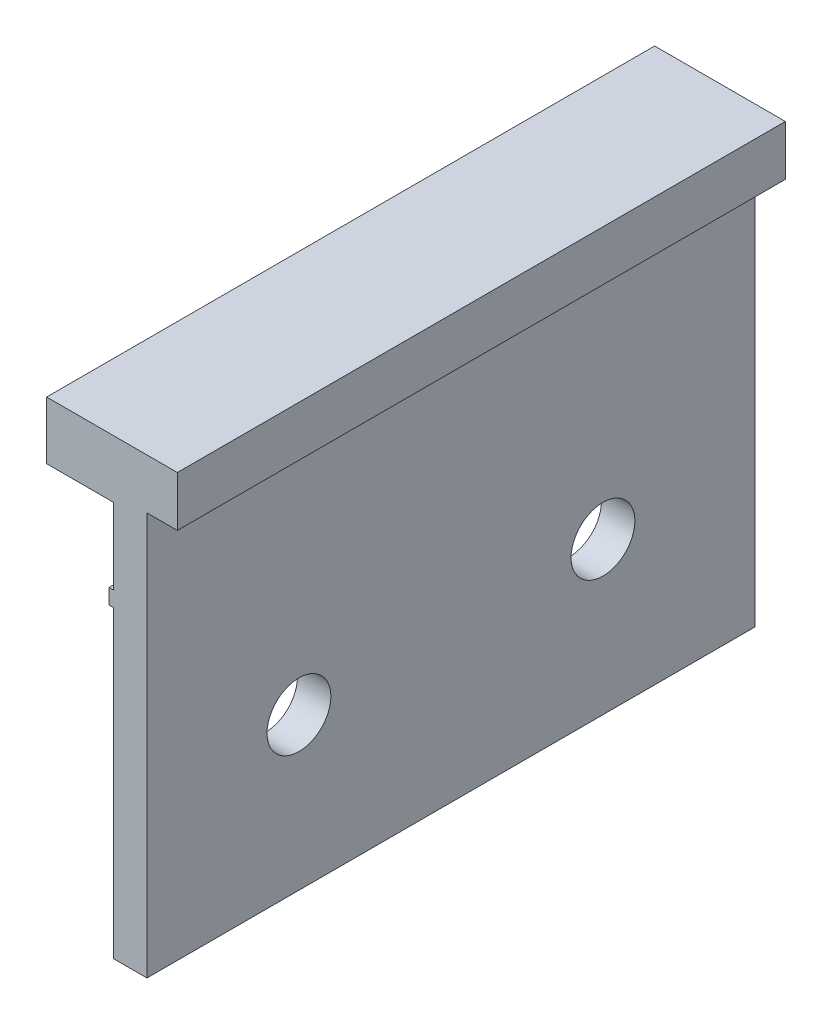
ISO-10303-21;
HEADER;
FILE_DESCRIPTION(('STEP AP214'),'2;1');
FILE_NAME('part.step','',(''),(''),'','','');
FILE_SCHEMA(('AUTOMOTIVE_DESIGN { 1 0 10303 214 1 1 1 1 }'));
ENDSEC;
DATA;
#1=APPLICATION_CONTEXT('core data for automotive mechanical design processes');
#2=APPLICATION_PROTOCOL_DEFINITION('international standard','automotive_design',2000,#1);
#3=PRODUCT_CONTEXT('',#1,'mechanical');
#4=PRODUCT('Part','Part','',(#3));
#5=PRODUCT_RELATED_PRODUCT_CATEGORY('part','',(#4));
#6=PRODUCT_DEFINITION_FORMATION('','',#4);
#7=PRODUCT_DEFINITION_CONTEXT('part definition',#1,'design');
#8=PRODUCT_DEFINITION('design','',#6,#7);
#9=PRODUCT_DEFINITION_SHAPE('','',#8);
#10=(LENGTH_UNIT() NAMED_UNIT(*) SI_UNIT(.MILLI.,.METRE.));
#11=(NAMED_UNIT(*) PLANE_ANGLE_UNIT() SI_UNIT($,.RADIAN.));
#12=(NAMED_UNIT(*) SI_UNIT($,.STERADIAN.) SOLID_ANGLE_UNIT());
#13=UNCERTAINTY_MEASURE_WITH_UNIT(LENGTH_MEASURE(1.E-05),#10,'distance_accuracy_value','');
#14=(GEOMETRIC_REPRESENTATION_CONTEXT(3) GLOBAL_UNCERTAINTY_ASSIGNED_CONTEXT((#13)) GLOBAL_UNIT_ASSIGNED_CONTEXT((#10,
#11,#12)) REPRESENTATION_CONTEXT('',''));
#15=CARTESIAN_POINT('',(0.,0.,0.));
#16=DIRECTION('',(0.,0.,1.));
#17=DIRECTION('',(1.,0.,0.));
#18=AXIS2_PLACEMENT_3D('',#15,#16,#17);
#19=CARTESIAN_POINT('',(-5.00000036964821,-291545.,51.0161248385694));
#20=DIRECTION('',(1.,0.,0.));
#21=DIRECTION('',(0.,0.,-1.));
#22=AXIS2_PLACEMENT_3D('',#19,#20,#21);
#23=PLANE('',#22);
#24=CARTESIAN_POINT('',(-5.00000036964821,-39.9999996303306,10.));
#25=DIRECTION('',(1.,0.,0.));
#26=DIRECTION('',(0.,0.,-1.));
#27=AXIS2_PLACEMENT_3D('',#24,#25,#26);
#28=CIRCLE('',#27,2.1);
#29=CARTESIAN_POINT('',(-5.00000036964821,-39.9999996303306,7.9));
#30=VERTEX_POINT('',#29);
#31=EDGE_CURVE('E193',#30,#30,#28,.T.);
#32=ORIENTED_EDGE('',*,*,#31,.T.);
#33=EDGE_LOOP('',(#32));
#34=FACE_BOUND('',#33,.T.);
#35=CARTESIAN_POINT('',(-5.00000036964821,-39.9999996303306,-10.));
#36=DIRECTION('',(1.,0.,0.));
#37=DIRECTION('',(0.,0.,-1.));
#38=AXIS2_PLACEMENT_3D('',#35,#36,#37);
#39=CIRCLE('',#38,2.1);
#40=CARTESIAN_POINT('',(-5.00000036964821,-39.9999996303306,-12.1));
#41=VERTEX_POINT('',#40);
#42=EDGE_CURVE('E192',#41,#41,#39,.T.);
#43=ORIENTED_EDGE('',*,*,#42,.T.);
#44=EDGE_LOOP('',(#43));
#45=FACE_BOUND('',#44,.T.);
#46=DIRECTION('',(0.,0.,-1.));
#47=VECTOR('',#46,1.);
#48=CARTESIAN_POINT('',(-5.00000036964821,-29.99999963032,21.0440306508794));
#49=LINE('',#48,#47);
#50=CARTESIAN_POINT('',(-5.00000036964821,-29.99999963032,20.));
#51=VERTEX_POINT('',#50);
#52=CARTESIAN_POINT('',(-5.00000036964821,-29.99999963032,-20.));
#53=VERTEX_POINT('',#52);
#54=EDGE_CURVE('E145',#51,#53,#49,.T.);
#55=ORIENTED_EDGE('',*,*,#54,.T.);
#56=DIRECTION('',(0.,-1.,0.));
#57=VECTOR('',#56,1.);
#58=CARTESIAN_POINT('',(-5.00000036964821,-291545.,-20.));
#59=LINE('',#58,#57);
#60=CARTESIAN_POINT('',(-5.00000036964821,-49.9999996303586,-20.));
#61=VERTEX_POINT('',#60);
#62=EDGE_CURVE('E180',#53,#61,#59,.T.);
#63=ORIENTED_EDGE('',*,*,#62,.T.);
#64=DIRECTION('',(0.,0.,-1.));
#65=VECTOR('',#64,1.);
#66=CARTESIAN_POINT('',(-5.00000036964821,-49.9999996303586,51.0161248385694));
#67=LINE('',#66,#65);
#68=CARTESIAN_POINT('',(-5.00000036964821,-49.9999996303586,20.));
#69=VERTEX_POINT('',#68);
#70=EDGE_CURVE('E181',#69,#61,#67,.T.);
#71=ORIENTED_EDGE('',*,*,#70,.F.);
#72=DIRECTION('',(0.,-1.,0.));
#73=VECTOR('',#72,1.);
#74=CARTESIAN_POINT('',(-5.00000036964821,-291545.,20.));
#75=LINE('',#74,#73);
#76=EDGE_CURVE('E151',#51,#69,#75,.T.);
#77=ORIENTED_EDGE('',*,*,#76,.F.);
#78=EDGE_LOOP('',(#55,#63,#71,#77));
#79=FACE_BOUND('',#78,.T.);
#80=ADVANCED_FACE('F35',(#34,#45,#79),#23,.F.);
#81=DIRECTION('',(0.,0.,-1.));
#82=VECTOR('',#81,1.);
#83=CARTESIAN_POINT('',(-5.00000036964821,-28.9999996303436,21.0440306508794));
#84=LINE('',#83,#82);
#85=CARTESIAN_POINT('',(-5.00000036964821,-28.9999996303436,20.));
#86=VERTEX_POINT('',#85);
#87=CARTESIAN_POINT('',(-5.00000036964821,-28.9999996303436,-20.));
#88=VERTEX_POINT('',#87);
#89=EDGE_CURVE('E130',#86,#88,#84,.T.);
#90=ORIENTED_EDGE('',*,*,#89,.F.);
#91=CARTESIAN_POINT('',(-5.00000036964821,-23.9999996303482,20.));
#92=VERTEX_POINT('',#91);
#93=EDGE_CURVE('E141',#92,#86,#75,.T.);
#94=ORIENTED_EDGE('',*,*,#93,.F.);
#95=DIRECTION('',(0.,0.,-1.));
#96=VECTOR('',#95,1.);
#97=CARTESIAN_POINT('',(-5.00000036964821,-23.9999996303482,51.0161248385694));
#98=LINE('',#97,#96);
#99=CARTESIAN_POINT('',(-5.00000036964821,-23.9999996303482,-20.));
#100=VERTEX_POINT('',#99);
#101=EDGE_CURVE('E178',#92,#100,#98,.T.);
#102=ORIENTED_EDGE('',*,*,#101,.T.);
#103=EDGE_CURVE('E144',#100,#88,#59,.T.);
#104=ORIENTED_EDGE('',*,*,#103,.T.);
#105=EDGE_LOOP('',(#90,#94,#102,#104));
#106=FACE_BOUND('',#105,.T.);
#107=ADVANCED_FACE('F140',(#106),#23,.F.);
#108=CARTESIAN_POINT('',(-0.80000036967931,-291545.,51.0161248385694));
#109=DIRECTION('',(-1.,0.,0.));
#110=DIRECTION('',(0.,0.,1.));
#111=AXIS2_PLACEMENT_3D('',#108,#109,#110);
#112=PLANE('',#111);
#113=DIRECTION('',(0.,1.,0.));
#114=VECTOR('',#113,1.);
#115=CARTESIAN_POINT('',(-0.80000036967931,-291545.,20.));
#116=LINE('',#115,#114);
#117=CARTESIAN_POINT('',(-0.80000036967931,-23.4999996303031,20.));
#118=VERTEX_POINT('',#117);
#119=CARTESIAN_POINT('',(-0.80000036967931,-20.1999996303357,20.));
#120=VERTEX_POINT('',#119);
#121=EDGE_CURVE('E162',#118,#120,#116,.T.);
#122=ORIENTED_EDGE('',*,*,#121,.F.);
#123=DIRECTION('',(0.,0.,-1.));
#124=VECTOR('',#123,1.);
#125=CARTESIAN_POINT('',(-0.80000036967931,-23.4999996303031,51.0161248385694));
#126=LINE('',#125,#124);
#127=CARTESIAN_POINT('',(-0.80000036967931,-23.4999996303031,-20.));
#128=VERTEX_POINT('',#127);
#129=EDGE_CURVE('E60',#118,#128,#126,.T.);
#130=ORIENTED_EDGE('',*,*,#129,.T.);
#131=DIRECTION('',(0.,1.,0.));
#132=VECTOR('',#131,1.);
#133=CARTESIAN_POINT('',(-0.80000036967931,-291545.,-20.));
#134=LINE('',#133,#132);
#135=CARTESIAN_POINT('',(-0.80000036967931,-20.1999996303357,-20.));
#136=VERTEX_POINT('',#135);
#137=EDGE_CURVE('E171',#128,#136,#134,.T.);
#138=ORIENTED_EDGE('',*,*,#137,.T.);
#139=DIRECTION('',(0.,0.,-1.));
#140=VECTOR('',#139,1.);
#141=CARTESIAN_POINT('',(-0.80000036967931,-20.1999996303357,51.0161248385694));
#142=LINE('',#141,#140);
#143=EDGE_CURVE('E168',#120,#136,#142,.T.);
#144=ORIENTED_EDGE('',*,*,#143,.F.);
#145=EDGE_LOOP('',(#122,#130,#138,#144));
#146=FACE_BOUND('',#145,.T.);
#147=ADVANCED_FACE('F233',(#146),#112,.F.);
#148=CARTESIAN_POINT('',(-400000.,-20.1999996303357,51.0161248385694));
#149=DIRECTION('',(0.,-1.,0.));
#150=DIRECTION('',(0.,0.,-1.));
#151=AXIS2_PLACEMENT_3D('',#148,#149,#150);
#152=PLANE('',#151);
#153=DIRECTION('',(-1.,0.,0.));
#154=VECTOR('',#153,1.);
#155=CARTESIAN_POINT('',(-400000.,-20.1999996303357,20.));
#156=LINE('',#155,#154);
#157=CARTESIAN_POINT('',(-9.40000036969998,-20.1999996303357,20.));
#158=VERTEX_POINT('',#157);
#159=EDGE_CURVE('E159',#120,#158,#156,.T.);
#160=ORIENTED_EDGE('',*,*,#159,.F.);
#161=ORIENTED_EDGE('',*,*,#143,.T.);
#162=DIRECTION('',(-1.,0.,0.));
#163=VECTOR('',#162,1.);
#164=CARTESIAN_POINT('',(-400000.,-20.1999996303357,-20.));
#165=LINE('',#164,#163);
#166=CARTESIAN_POINT('',(-9.40000036969998,-20.1999996303357,-20.));
#167=VERTEX_POINT('',#166);
#168=EDGE_CURVE('E170',#136,#167,#165,.T.);
#169=ORIENTED_EDGE('',*,*,#168,.T.);
#170=DIRECTION('',(0.,0.,-1.));
#171=VECTOR('',#170,1.);
#172=CARTESIAN_POINT('',(-9.40000036969998,-20.1999996303357,51.0161248385694));
#173=LINE('',#172,#171);
#174=EDGE_CURVE('E172',#158,#167,#173,.T.);
#175=ORIENTED_EDGE('',*,*,#174,.F.);
#176=EDGE_LOOP('',(#160,#161,#169,#175));
#177=FACE_BOUND('',#176,.T.);
#178=ADVANCED_FACE('F243',(#177),#152,.F.);
#179=CARTESIAN_POINT('',(-9.4000003695669,-291545.,51.0161248385694));
#180=DIRECTION('',(1.,0.,0.));
#181=DIRECTION('',(0.,1.,0.));
#182=AXIS2_PLACEMENT_3D('',#179,#180,#181);
#183=PLANE('',#182);
#184=DIRECTION('',(0.,-1.,0.));
#185=VECTOR('',#184,1.);
#186=CARTESIAN_POINT('',(-9.4000003695669,-291545.,20.));
#187=LINE('',#186,#185);
#188=CARTESIAN_POINT('',(-9.40000036968058,-23.9999996303537,20.));
#189=VERTEX_POINT('',#188);
#190=EDGE_CURVE('E157',#158,#189,#187,.T.);
#191=ORIENTED_EDGE('',*,*,#190,.F.);
#192=ORIENTED_EDGE('',*,*,#174,.T.);
#193=DIRECTION('',(0.,-1.,0.));
#194=VECTOR('',#193,1.);
#195=CARTESIAN_POINT('',(-9.4000003695669,-291545.,-20.));
#196=LINE('',#195,#194);
#197=CARTESIAN_POINT('',(-9.40000036968058,-23.9999996303537,-20.));
#198=VERTEX_POINT('',#197);
#199=EDGE_CURVE('E174',#167,#198,#196,.T.);
#200=ORIENTED_EDGE('',*,*,#199,.T.);
#201=DIRECTION('',(0.,0.,-1.));
#202=VECTOR('',#201,1.);
#203=CARTESIAN_POINT('',(-9.40000036968058,-23.9999996303537,51.0161248385694));
#204=LINE('',#203,#202);
#205=EDGE_CURVE('E175',#189,#198,#204,.T.);
#206=ORIENTED_EDGE('',*,*,#205,.F.);
#207=EDGE_LOOP('',(#191,#192,#200,#206));
#208=FACE_BOUND('',#207,.T.);
#209=ADVANCED_FACE('F267',(#208),#183,.F.);
#210=CARTESIAN_POINT('',(-399999.999999999,-23.9999996297229,51.0161248385694));
#211=DIRECTION('',(0.,1.,0.));
#212=DIRECTION('',(-1.,0.,0.));
#213=AXIS2_PLACEMENT_3D('',#210,#211,#212);
#214=PLANE('',#213);
#215=DIRECTION('',(1.,0.,0.));
#216=VECTOR('',#215,1.);
#217=CARTESIAN_POINT('',(-399999.999999999,-23.9999996297229,20.));
#218=LINE('',#217,#216);
#219=EDGE_CURVE('E150',#189,#92,#218,.T.);
#220=ORIENTED_EDGE('',*,*,#219,.F.);
#221=ORIENTED_EDGE('',*,*,#205,.T.);
#222=DIRECTION('',(1.,0.,0.));
#223=VECTOR('',#222,1.);
#224=CARTESIAN_POINT('',(-399999.999999999,-23.9999996297229,-20.));
#225=LINE('',#224,#223);
#226=EDGE_CURVE('E177',#198,#100,#225,.T.);
#227=ORIENTED_EDGE('',*,*,#226,.T.);
#228=ORIENTED_EDGE('',*,*,#101,.F.);
#229=EDGE_LOOP('',(#220,#221,#227,#228));
#230=FACE_BOUND('',#229,.T.);
#231=ADVANCED_FACE('F264',(#230),#214,.F.);
#232=CARTESIAN_POINT('',(-400000.,-49.9999996303586,51.0161248385694));
#233=DIRECTION('',(0.,1.,0.));
#234=DIRECTION('',(0.,0.,1.));
#235=AXIS2_PLACEMENT_3D('',#232,#233,#234);
#236=PLANE('',#235);
#237=DIRECTION('',(1.,0.,0.));
#238=VECTOR('',#237,1.);
#239=CARTESIAN_POINT('',(-400000.,-49.9999996303586,20.));
#240=LINE('',#239,#238);
#241=CARTESIAN_POINT('',(-2.80000036968886,-49.9999996303586,20.));
#242=VERTEX_POINT('',#241);
#243=EDGE_CURVE('E44',#69,#242,#240,.T.);
#244=ORIENTED_EDGE('',*,*,#243,.F.);
#245=ORIENTED_EDGE('',*,*,#70,.T.);
#246=DIRECTION('',(1.,0.,0.));
#247=VECTOR('',#246,1.);
#248=CARTESIAN_POINT('',(-400000.,-49.9999996303586,-20.));
#249=LINE('',#248,#247);
#250=CARTESIAN_POINT('',(-2.80000036968886,-49.9999996303586,-20.));
#251=VERTEX_POINT('',#250);
#252=EDGE_CURVE('E184',#61,#251,#249,.T.);
#253=ORIENTED_EDGE('',*,*,#252,.T.);
#254=DIRECTION('',(0.,0.,-1.));
#255=VECTOR('',#254,1.);
#256=CARTESIAN_POINT('',(-2.80000036968886,-49.9999996303586,51.0161248385694));
#257=LINE('',#256,#255);
#258=EDGE_CURVE('E185',#242,#251,#257,.T.);
#259=ORIENTED_EDGE('',*,*,#258,.F.);
#260=EDGE_LOOP('',(#244,#245,#253,#259));
#261=FACE_BOUND('',#260,.T.);
#262=ADVANCED_FACE('F253',(#261),#236,.F.);
#263=CARTESIAN_POINT('',(-2.80000036968886,-291545.,51.0161248385694));
#264=DIRECTION('',(-1.,0.,0.));
#265=DIRECTION('',(0.,0.,1.));
#266=AXIS2_PLACEMENT_3D('',#263,#264,#265);
#267=PLANE('',#266);
#268=CARTESIAN_POINT('',(-2.80000036968886,-39.9999996303306,10.));
#269=DIRECTION('',(-1.,0.,0.));
#270=DIRECTION('',(0.,0.,1.));
#271=AXIS2_PLACEMENT_3D('',#268,#269,#270);
#272=CIRCLE('',#271,2.1);
#273=CARTESIAN_POINT('',(-2.80000036968886,-39.9999996303306,12.1));
#274=VERTEX_POINT('',#273);
#275=EDGE_CURVE('E39',#274,#274,#272,.T.);
#276=ORIENTED_EDGE('',*,*,#275,.T.);
#277=EDGE_LOOP('',(#276));
#278=FACE_BOUND('',#277,.T.);
#279=CARTESIAN_POINT('',(-2.80000036968886,-39.9999996303306,-10.));
#280=DIRECTION('',(-1.,0.,0.));
#281=DIRECTION('',(0.,0.,1.));
#282=AXIS2_PLACEMENT_3D('',#279,#280,#281);
#283=CIRCLE('',#282,2.1);
#284=CARTESIAN_POINT('',(-2.80000036968886,-39.9999996303306,-7.9));
#285=VERTEX_POINT('',#284);
#286=EDGE_CURVE('E190',#285,#285,#283,.T.);
#287=ORIENTED_EDGE('',*,*,#286,.T.);
#288=EDGE_LOOP('',(#287));
#289=FACE_BOUND('',#288,.T.);
#290=DIRECTION('',(0.,1.,0.));
#291=VECTOR('',#290,1.);
#292=CARTESIAN_POINT('',(-2.80000036968886,-291545.,20.));
#293=LINE('',#292,#291);
#294=CARTESIAN_POINT('',(-2.80000036968886,-23.4999996303031,20.));
#295=VERTEX_POINT('',#294);
#296=EDGE_CURVE('E11',#242,#295,#293,.T.);
#297=ORIENTED_EDGE('',*,*,#296,.F.);
#298=ORIENTED_EDGE('',*,*,#258,.T.);
#299=DIRECTION('',(0.,1.,0.));
#300=VECTOR('',#299,1.);
#301=CARTESIAN_POINT('',(-2.80000036968886,-291545.,-20.));
#302=LINE('',#301,#300);
#303=CARTESIAN_POINT('',(-2.80000036968886,-23.4999996303031,-20.));
#304=VERTEX_POINT('',#303);
#305=EDGE_CURVE('E187',#251,#304,#302,.T.);
#306=ORIENTED_EDGE('',*,*,#305,.T.);
#307=DIRECTION('',(0.,0.,-1.));
#308=VECTOR('',#307,1.);
#309=CARTESIAN_POINT('',(-2.80000036968886,-23.4999996303031,51.0161248385694));
#310=LINE('',#309,#308);
#311=EDGE_CURVE('E188',#295,#304,#310,.T.);
#312=ORIENTED_EDGE('',*,*,#311,.F.);
#313=EDGE_LOOP('',(#297,#298,#306,#312));
#314=FACE_BOUND('',#313,.T.);
#315=ADVANCED_FACE('F246',(#278,#289,#314),#267,.F.);
#316=CARTESIAN_POINT('',(-400000.,-23.4999996303031,51.0161248385694));
#317=DIRECTION('',(0.,1.,0.));
#318=DIRECTION('',(0.,0.,1.));
#319=AXIS2_PLACEMENT_3D('',#316,#317,#318);
#320=PLANE('',#319);
#321=DIRECTION('',(1.,0.,0.));
#322=VECTOR('',#321,1.);
#323=CARTESIAN_POINT('',(-400000.,-23.4999996303031,20.));
#324=LINE('',#323,#322);
#325=EDGE_CURVE('E165',#295,#118,#324,.T.);
#326=ORIENTED_EDGE('',*,*,#325,.F.);
#327=ORIENTED_EDGE('',*,*,#311,.T.);
#328=DIRECTION('',(1.,0.,0.));
#329=VECTOR('',#328,1.);
#330=CARTESIAN_POINT('',(-400000.,-23.4999996303031,-20.));
#331=LINE('',#330,#329);
#332=EDGE_CURVE('E167',#304,#128,#331,.T.);
#333=ORIENTED_EDGE('',*,*,#332,.T.);
#334=ORIENTED_EDGE('',*,*,#129,.F.);
#335=EDGE_LOOP('',(#326,#327,#333,#334));
#336=FACE_BOUND('',#335,.T.);
#337=ADVANCED_FACE('F244',(#336),#320,.F.);
#338=CARTESIAN_POINT('',(0.,0.,-20.));
#339=DIRECTION('',(0.,0.,1.));
#340=DIRECTION('',(1.,0.,0.));
#341=AXIS2_PLACEMENT_3D('',#338,#339,#340);
#342=PLANE('',#341);
#343=ORIENTED_EDGE('',*,*,#137,.F.);
#344=ORIENTED_EDGE('',*,*,#332,.F.);
#345=ORIENTED_EDGE('',*,*,#305,.F.);
#346=ORIENTED_EDGE('',*,*,#252,.F.);
#347=ORIENTED_EDGE('',*,*,#62,.F.);
#348=DIRECTION('',(1.,0.,0.));
#349=VECTOR('',#348,1.);
#350=CARTESIAN_POINT('',(-400000.,-29.99999963032,-20.));
#351=LINE('',#350,#349);
#352=CARTESIAN_POINT('',(-5.30000036968659,-29.99999963032,-20.));
#353=VERTEX_POINT('',#352);
#354=EDGE_CURVE('E205',#353,#53,#351,.T.);
#355=ORIENTED_EDGE('',*,*,#354,.F.);
#356=DIRECTION('',(0.,-1.,0.));
#357=VECTOR('',#356,1.);
#358=CARTESIAN_POINT('',(-5.30000036968659,-291545.,-20.));
#359=LINE('',#358,#357);
#360=CARTESIAN_POINT('',(-5.30000036968659,-28.9999996303436,-20.));
#361=VERTEX_POINT('',#360);
#362=EDGE_CURVE('E208',#361,#353,#359,.T.);
#363=ORIENTED_EDGE('',*,*,#362,.F.);
#364=DIRECTION('',(-1.,0.,0.));
#365=VECTOR('',#364,1.);
#366=CARTESIAN_POINT('',(-400000.,-28.9999996303436,-20.));
#367=LINE('',#366,#365);
#368=EDGE_CURVE('E136',#88,#361,#367,.T.);
#369=ORIENTED_EDGE('',*,*,#368,.F.);
#370=ORIENTED_EDGE('',*,*,#103,.F.);
#371=ORIENTED_EDGE('',*,*,#226,.F.);
#372=ORIENTED_EDGE('',*,*,#199,.F.);
#373=ORIENTED_EDGE('',*,*,#168,.F.);
#374=EDGE_LOOP('',(#343,#344,#345,#346,#347,#355,#363,#369,#370,#371,#372,#373));
#375=FACE_BOUND('',#374,.T.);
#376=ADVANCED_FACE('F237',(#375),#342,.F.);
#377=CARTESIAN_POINT('',(0.,0.,20.));
#378=DIRECTION('',(0.,0.,1.));
#379=DIRECTION('',(1.,0.,0.));
#380=AXIS2_PLACEMENT_3D('',#377,#378,#379);
#381=PLANE('',#380);
#382=ORIENTED_EDGE('',*,*,#325,.T.);
#383=ORIENTED_EDGE('',*,*,#121,.T.);
#384=ORIENTED_EDGE('',*,*,#159,.T.);
#385=ORIENTED_EDGE('',*,*,#190,.T.);
#386=ORIENTED_EDGE('',*,*,#219,.T.);
#387=ORIENTED_EDGE('',*,*,#93,.T.);
#388=DIRECTION('',(-1.,0.,0.));
#389=VECTOR('',#388,1.);
#390=CARTESIAN_POINT('',(-400000.,-28.9999996303436,20.));
#391=LINE('',#390,#389);
#392=CARTESIAN_POINT('',(-5.30000036968659,-28.9999996303436,20.));
#393=VERTEX_POINT('',#392);
#394=EDGE_CURVE('E126',#86,#393,#391,.T.);
#395=ORIENTED_EDGE('',*,*,#394,.T.);
#396=DIRECTION('',(0.,-1.,0.));
#397=VECTOR('',#396,1.);
#398=CARTESIAN_POINT('',(-5.30000036968659,-291545.,20.));
#399=LINE('',#398,#397);
#400=CARTESIAN_POINT('',(-5.30000036968659,-29.99999963032,20.));
#401=VERTEX_POINT('',#400);
#402=EDGE_CURVE('E135',#393,#401,#399,.T.);
#403=ORIENTED_EDGE('',*,*,#402,.T.);
#404=DIRECTION('',(1.,0.,0.));
#405=VECTOR('',#404,1.);
#406=CARTESIAN_POINT('',(-400000.,-29.99999963032,20.));
#407=LINE('',#406,#405);
#408=EDGE_CURVE('E52',#401,#51,#407,.T.);
#409=ORIENTED_EDGE('',*,*,#408,.T.);
#410=ORIENTED_EDGE('',*,*,#76,.T.);
#411=ORIENTED_EDGE('',*,*,#243,.T.);
#412=ORIENTED_EDGE('',*,*,#296,.T.);
#413=EDGE_LOOP('',(#382,#383,#384,#385,#386,#387,#395,#403,#409,#410,#411,#412));
#414=FACE_BOUND('',#413,.T.);
#415=ADVANCED_FACE('F37',(#414),#381,.T.);
#416=CARTESIAN_POINT('',(-5.30000036968659,-291545.,21.0440306508794));
#417=DIRECTION('',(1.,0.,0.));
#418=DIRECTION('',(0.,0.,-1.));
#419=AXIS2_PLACEMENT_3D('',#416,#417,#418);
#420=PLANE('',#419);
#421=ORIENTED_EDGE('',*,*,#402,.F.);
#422=DIRECTION('',(0.,0.,-1.));
#423=VECTOR('',#422,1.);
#424=CARTESIAN_POINT('',(-5.30000036968659,-28.9999996303436,21.0440306508794));
#425=LINE('',#424,#423);
#426=EDGE_CURVE('E132',#393,#361,#425,.T.);
#427=ORIENTED_EDGE('',*,*,#426,.T.);
#428=ORIENTED_EDGE('',*,*,#362,.T.);
#429=DIRECTION('',(0.,0.,-1.));
#430=VECTOR('',#429,1.);
#431=CARTESIAN_POINT('',(-5.30000036968659,-29.99999963032,21.0440306508794));
#432=LINE('',#431,#430);
#433=EDGE_CURVE('E207',#401,#353,#432,.T.);
#434=ORIENTED_EDGE('',*,*,#433,.F.);
#435=EDGE_LOOP('',(#421,#427,#428,#434));
#436=FACE_BOUND('',#435,.T.);
#437=ADVANCED_FACE('F262',(#436),#420,.F.);
#438=CARTESIAN_POINT('',(-400000.,-29.99999963032,21.0440306508794));
#439=DIRECTION('',(0.,1.,0.));
#440=DIRECTION('',(0.,0.,1.));
#441=AXIS2_PLACEMENT_3D('',#438,#439,#440);
#442=PLANE('',#441);
#443=ORIENTED_EDGE('',*,*,#408,.F.);
#444=ORIENTED_EDGE('',*,*,#433,.T.);
#445=ORIENTED_EDGE('',*,*,#354,.T.);
#446=ORIENTED_EDGE('',*,*,#54,.F.);
#447=EDGE_LOOP('',(#443,#444,#445,#446));
#448=FACE_BOUND('',#447,.T.);
#449=ADVANCED_FACE('F258',(#448),#442,.F.);
#450=CARTESIAN_POINT('',(-400000.,-28.9999996303436,21.0440306508794));
#451=DIRECTION('',(0.,-1.,0.));
#452=DIRECTION('',(0.,0.,-1.));
#453=AXIS2_PLACEMENT_3D('',#450,#451,#452);
#454=PLANE('',#453);
#455=ORIENTED_EDGE('',*,*,#394,.F.);
#456=ORIENTED_EDGE('',*,*,#89,.T.);
#457=ORIENTED_EDGE('',*,*,#368,.T.);
#458=ORIENTED_EDGE('',*,*,#426,.F.);
#459=EDGE_LOOP('',(#455,#456,#457,#458));
#460=FACE_BOUND('',#459,.T.);
#461=ADVANCED_FACE('F128',(#460),#454,.F.);
#462=CARTESIAN_POINT('',(-9.40000036969998,-39.9999996303306,-10.));
#463=DIRECTION('',(1.,0.,0.));
#464=DIRECTION('',(0.,0.,-1.));
#465=AXIS2_PLACEMENT_3D('',#462,#463,#464);
#466=CYLINDRICAL_SURFACE('',#465,2.1);
#467=ORIENTED_EDGE('',*,*,#286,.F.);
#468=EDGE_LOOP('',(#467));
#469=FACE_BOUND('',#468,.T.);
#470=ORIENTED_EDGE('',*,*,#42,.F.);
#471=EDGE_LOOP('',(#470));
#472=FACE_BOUND('',#471,.T.);
#473=ADVANCED_FACE('F298',(#469,#472),#466,.F.);
#474=CARTESIAN_POINT('',(-9.40000036969998,-39.9999996303306,10.));
#475=DIRECTION('',(1.,0.,0.));
#476=DIRECTION('',(0.,0.,-1.));
#477=AXIS2_PLACEMENT_3D('',#474,#475,#476);
#478=CYLINDRICAL_SURFACE('',#477,2.1);
#479=ORIENTED_EDGE('',*,*,#275,.F.);
#480=EDGE_LOOP('',(#479));
#481=FACE_BOUND('',#480,.T.);
#482=ORIENTED_EDGE('',*,*,#31,.F.);
#483=EDGE_LOOP('',(#482));
#484=FACE_BOUND('',#483,.T.);
#485=ADVANCED_FACE('F301',(#481,#484),#478,.F.);
#486=CLOSED_SHELL('',(#80,#107,#147,#178,#209,#231,#262,#315,#337,#376,#415,#437,#449,#461,#473,#485));
#487=MANIFOLD_SOLID_BREP('B2',#486);
#488=ADVANCED_BREP_SHAPE_REPRESENTATION('',(#18,#487),#14);
#489=SHAPE_DEFINITION_REPRESENTATION(#9,#488);
ENDSEC;
END-ISO-10303-21;
